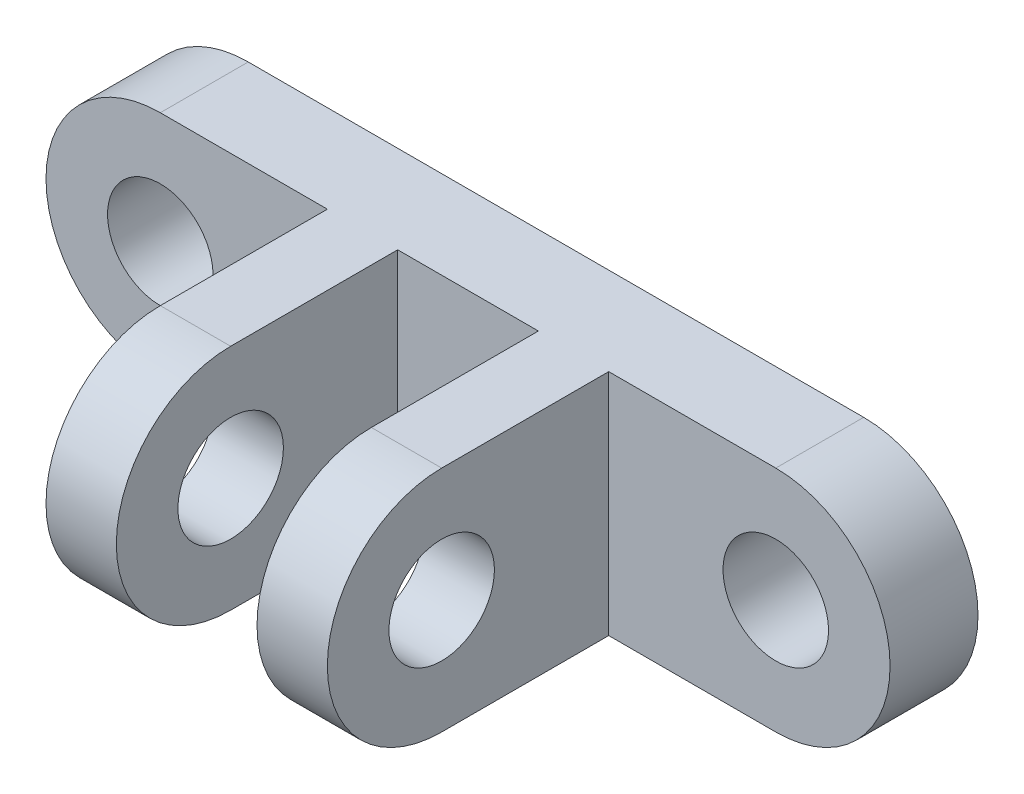
ISO-10303-21;
HEADER;
FILE_DESCRIPTION(('STEP AP214'),'2;1');
FILE_NAME('part.step','',(''),(''),'','','');
FILE_SCHEMA(('AUTOMOTIVE_DESIGN { 1 0 10303 214 1 1 1 1 }'));
ENDSEC;
DATA;
#1=APPLICATION_CONTEXT('core data for automotive mechanical design processes');
#2=APPLICATION_PROTOCOL_DEFINITION('international standard','automotive_design',2000,#1);
#3=PRODUCT_CONTEXT('',#1,'mechanical');
#4=PRODUCT('Part','Part','',(#3));
#5=PRODUCT_RELATED_PRODUCT_CATEGORY('part','',(#4));
#6=PRODUCT_DEFINITION_FORMATION('','',#4);
#7=PRODUCT_DEFINITION_CONTEXT('part definition',#1,'design');
#8=PRODUCT_DEFINITION('design','',#6,#7);
#9=PRODUCT_DEFINITION_SHAPE('','',#8);
#10=(LENGTH_UNIT() NAMED_UNIT(*) SI_UNIT(.MILLI.,.METRE.));
#11=(NAMED_UNIT(*) PLANE_ANGLE_UNIT() SI_UNIT($,.RADIAN.));
#12=(NAMED_UNIT(*) SI_UNIT($,.STERADIAN.) SOLID_ANGLE_UNIT());
#13=UNCERTAINTY_MEASURE_WITH_UNIT(LENGTH_MEASURE(1.E-05),#10,'distance_accuracy_value','');
#14=(GEOMETRIC_REPRESENTATION_CONTEXT(3) GLOBAL_UNCERTAINTY_ASSIGNED_CONTEXT((#13)) GLOBAL_UNIT_ASSIGNED_CONTEXT((#10,
#11,#12)) REPRESENTATION_CONTEXT('',''));
#15=CARTESIAN_POINT('',(0.,0.,0.));
#16=DIRECTION('',(0.,0.,1.));
#17=DIRECTION('',(1.,0.,0.));
#18=AXIS2_PLACEMENT_3D('',#15,#16,#17);
#19=CARTESIAN_POINT('',(-35.,0.,10.));
#20=DIRECTION('',(0.,0.,1.));
#21=DIRECTION('',(1.,0.,0.));
#22=AXIS2_PLACEMENT_3D('',#19,#20,#21);
#23=PLANE('',#22);
#24=DIRECTION('',(-1.,0.,0.));
#25=VECTOR('',#24,1.);
#26=CARTESIAN_POINT('',(-35.,13.,10.));
#27=LINE('',#26,#25);
#28=CARTESIAN_POINT('',(8.,13.,10.));
#29=VERTEX_POINT('',#28);
#30=CARTESIAN_POINT('',(-8.,13.,10.));
#31=VERTEX_POINT('',#30);
#32=EDGE_CURVE('E217',#29,#31,#27,.T.);
#33=ORIENTED_EDGE('',*,*,#32,.T.);
#34=DIRECTION('',(0.,1.,0.));
#35=VECTOR('',#34,1.);
#36=CARTESIAN_POINT('',(-8.,13.,10.));
#37=LINE('',#36,#35);
#38=CARTESIAN_POINT('',(-8.,-13.,10.));
#39=VERTEX_POINT('',#38);
#40=EDGE_CURVE('E51',#39,#31,#37,.T.);
#41=ORIENTED_EDGE('',*,*,#40,.F.);
#42=DIRECTION('',(1.,0.,0.));
#43=VECTOR('',#42,1.);
#44=CARTESIAN_POINT('',(-35.,-13.,10.));
#45=LINE('',#44,#43);
#46=CARTESIAN_POINT('',(8.,-13.,10.));
#47=VERTEX_POINT('',#46);
#48=EDGE_CURVE('E211',#39,#47,#45,.T.);
#49=ORIENTED_EDGE('',*,*,#48,.T.);
#50=DIRECTION('',(0.,1.,0.));
#51=VECTOR('',#50,1.);
#52=CARTESIAN_POINT('',(8.,13.,10.));
#53=LINE('',#52,#51);
#54=EDGE_CURVE('E165',#47,#29,#53,.T.);
#55=ORIENTED_EDGE('',*,*,#54,.T.);
#56=EDGE_LOOP('',(#33,#41,#49,#55));
#57=FACE_BOUND('',#56,.T.);
#58=ADVANCED_FACE('F36',(#57),#23,.T.);
#59=DIRECTION('',(0.,1.,0.));
#60=VECTOR('',#59,1.);
#61=CARTESIAN_POINT('',(-16.,13.,10.));
#62=LINE('',#61,#60);
#63=CARTESIAN_POINT('',(-16.,-13.,10.));
#64=VERTEX_POINT('',#63);
#65=CARTESIAN_POINT('',(-16.,13.,10.));
#66=VERTEX_POINT('',#65);
#67=EDGE_CURVE('E145',#64,#66,#62,.T.);
#68=ORIENTED_EDGE('',*,*,#67,.T.);
#69=CARTESIAN_POINT('',(-35.,13.,10.));
#70=VERTEX_POINT('',#69);
#71=EDGE_CURVE('E213',#66,#70,#27,.T.);
#72=ORIENTED_EDGE('',*,*,#71,.T.);
#73=CARTESIAN_POINT('',(-35.,0.,10.));
#74=DIRECTION('',(0.,0.,1.));
#75=DIRECTION('',(1.,0.,0.));
#76=AXIS2_PLACEMENT_3D('',#73,#74,#75);
#77=CIRCLE('',#76,13.);
#78=CARTESIAN_POINT('',(-35.,-13.,10.));
#79=VERTEX_POINT('',#78);
#80=EDGE_CURVE('E205',#70,#79,#77,.T.);
#81=ORIENTED_EDGE('',*,*,#80,.T.);
#82=EDGE_CURVE('E59',#79,#64,#45,.T.);
#83=ORIENTED_EDGE('',*,*,#82,.T.);
#84=EDGE_LOOP('',(#68,#72,#81,#83));
#85=FACE_BOUND('',#84,.T.);
#86=CARTESIAN_POINT('',(-35.,0.,10.));
#87=DIRECTION('',(0.,0.,1.));
#88=DIRECTION('',(1.,0.,0.));
#89=AXIS2_PLACEMENT_3D('',#86,#87,#88);
#90=CIRCLE('',#89,6.);
#91=CARTESIAN_POINT('',(-29.,0.,10.));
#92=VERTEX_POINT('',#91);
#93=EDGE_CURVE('E199',#92,#92,#90,.T.);
#94=ORIENTED_EDGE('',*,*,#93,.F.);
#95=EDGE_LOOP('',(#94));
#96=FACE_BOUND('',#95,.T.);
#97=ADVANCED_FACE('F249',(#85,#96),#23,.T.);
#98=DIRECTION('',(0.,1.,0.));
#99=VECTOR('',#98,1.);
#100=CARTESIAN_POINT('',(16.,13.,10.));
#101=LINE('',#100,#99);
#102=CARTESIAN_POINT('',(16.,-13.,10.));
#103=VERTEX_POINT('',#102);
#104=CARTESIAN_POINT('',(16.,13.,10.));
#105=VERTEX_POINT('',#104);
#106=EDGE_CURVE('E168',#103,#105,#101,.T.);
#107=ORIENTED_EDGE('',*,*,#106,.F.);
#108=CARTESIAN_POINT('',(35.,-13.,10.));
#109=VERTEX_POINT('',#108);
#110=EDGE_CURVE('E207',#103,#109,#45,.T.);
#111=ORIENTED_EDGE('',*,*,#110,.T.);
#112=CARTESIAN_POINT('',(35.,0.,10.));
#113=DIRECTION('',(0.,0.,1.));
#114=DIRECTION('',(1.,0.,0.));
#115=AXIS2_PLACEMENT_3D('',#112,#113,#114);
#116=CIRCLE('',#115,13.);
#117=CARTESIAN_POINT('',(35.,13.,10.));
#118=VERTEX_POINT('',#117);
#119=EDGE_CURVE('E210',#109,#118,#116,.T.);
#120=ORIENTED_EDGE('',*,*,#119,.T.);
#121=EDGE_CURVE('E214',#118,#105,#27,.T.);
#122=ORIENTED_EDGE('',*,*,#121,.T.);
#123=EDGE_LOOP('',(#107,#111,#120,#122));
#124=FACE_BOUND('',#123,.T.);
#125=CARTESIAN_POINT('',(35.,0.,10.));
#126=DIRECTION('',(0.,0.,1.));
#127=DIRECTION('',(1.,0.,0.));
#128=AXIS2_PLACEMENT_3D('',#125,#126,#127);
#129=CIRCLE('',#128,6.);
#130=CARTESIAN_POINT('',(41.,0.,10.));
#131=VERTEX_POINT('',#130);
#132=EDGE_CURVE('E193',#131,#131,#129,.T.);
#133=ORIENTED_EDGE('',*,*,#132,.F.);
#134=EDGE_LOOP('',(#133));
#135=FACE_BOUND('',#134,.T.);
#136=ADVANCED_FACE('F273',(#124,#135),#23,.T.);
#137=CARTESIAN_POINT('',(-35.,0.,0.));
#138=DIRECTION('',(0.,0.,1.));
#139=DIRECTION('',(1.,0.,0.));
#140=AXIS2_PLACEMENT_3D('',#137,#138,#139);
#141=PLANE('',#140);
#142=CARTESIAN_POINT('',(-35.,0.,0.));
#143=DIRECTION('',(0.,0.,1.));
#144=DIRECTION('',(1.,0.,0.));
#145=AXIS2_PLACEMENT_3D('',#142,#143,#144);
#146=CIRCLE('',#145,13.);
#147=CARTESIAN_POINT('',(-35.,13.,0.));
#148=VERTEX_POINT('',#147);
#149=CARTESIAN_POINT('',(-35.,-13.,0.));
#150=VERTEX_POINT('',#149);
#151=EDGE_CURVE('E202',#148,#150,#146,.T.);
#152=ORIENTED_EDGE('',*,*,#151,.F.);
#153=DIRECTION('',(-1.,0.,0.));
#154=VECTOR('',#153,1.);
#155=CARTESIAN_POINT('',(-35.,13.,0.));
#156=LINE('',#155,#154);
#157=CARTESIAN_POINT('',(35.,13.,0.));
#158=VERTEX_POINT('',#157);
#159=EDGE_CURVE('E208',#158,#148,#156,.T.);
#160=ORIENTED_EDGE('',*,*,#159,.F.);
#161=CARTESIAN_POINT('',(35.,0.,0.));
#162=DIRECTION('',(0.,0.,1.));
#163=DIRECTION('',(1.,0.,0.));
#164=AXIS2_PLACEMENT_3D('',#161,#162,#163);
#165=CIRCLE('',#164,13.);
#166=CARTESIAN_POINT('',(35.,-13.,0.));
#167=VERTEX_POINT('',#166);
#168=EDGE_CURVE('E222',#167,#158,#165,.T.);
#169=ORIENTED_EDGE('',*,*,#168,.F.);
#170=DIRECTION('',(1.,0.,0.));
#171=VECTOR('',#170,1.);
#172=CARTESIAN_POINT('',(-35.,-13.,0.));
#173=LINE('',#172,#171);
#174=EDGE_CURVE('E220',#150,#167,#173,.T.);
#175=ORIENTED_EDGE('',*,*,#174,.F.);
#176=EDGE_LOOP('',(#152,#160,#169,#175));
#177=FACE_BOUND('',#176,.T.);
#178=CARTESIAN_POINT('',(-35.,0.,0.));
#179=DIRECTION('',(0.,0.,1.));
#180=DIRECTION('',(1.,0.,0.));
#181=AXIS2_PLACEMENT_3D('',#178,#179,#180);
#182=CIRCLE('',#181,6.);
#183=CARTESIAN_POINT('',(-29.,0.,0.));
#184=VERTEX_POINT('',#183);
#185=EDGE_CURVE('E196',#184,#184,#182,.T.);
#186=ORIENTED_EDGE('',*,*,#185,.T.);
#187=EDGE_LOOP('',(#186));
#188=FACE_BOUND('',#187,.T.);
#189=CARTESIAN_POINT('',(35.,0.,0.));
#190=DIRECTION('',(0.,0.,1.));
#191=DIRECTION('',(1.,0.,0.));
#192=AXIS2_PLACEMENT_3D('',#189,#190,#191);
#193=CIRCLE('',#192,6.);
#194=CARTESIAN_POINT('',(41.,0.,0.));
#195=VERTEX_POINT('',#194);
#196=EDGE_CURVE('E192',#195,#195,#193,.T.);
#197=ORIENTED_EDGE('',*,*,#196,.T.);
#198=EDGE_LOOP('',(#197));
#199=FACE_BOUND('',#198,.T.);
#200=ADVANCED_FACE('F240',(#177,#188,#199),#141,.F.);
#201=CARTESIAN_POINT('',(-35.,0.,10.));
#202=DIRECTION('',(0.,0.,-1.));
#203=DIRECTION('',(-1.,0.,0.));
#204=AXIS2_PLACEMENT_3D('',#201,#202,#203);
#205=CYLINDRICAL_SURFACE('',#204,13.);
#206=ORIENTED_EDGE('',*,*,#151,.T.);
#207=DIRECTION('',(0.,0.,-1.));
#208=VECTOR('',#207,1.);
#209=CARTESIAN_POINT('',(-35.,-13.,10.));
#210=LINE('',#209,#208);
#211=EDGE_CURVE('E11',#79,#150,#210,.T.);
#212=ORIENTED_EDGE('',*,*,#211,.F.);
#213=ORIENTED_EDGE('',*,*,#80,.F.);
#214=DIRECTION('',(0.,0.,-1.));
#215=VECTOR('',#214,1.);
#216=CARTESIAN_POINT('',(-35.,13.,10.));
#217=LINE('',#216,#215);
#218=EDGE_CURVE('E216',#70,#148,#217,.T.);
#219=ORIENTED_EDGE('',*,*,#218,.T.);
#220=EDGE_LOOP('',(#206,#212,#213,#219));
#221=FACE_BOUND('',#220,.T.);
#222=ADVANCED_FACE('F38',(#221),#205,.T.);
#223=CARTESIAN_POINT('',(-35.,-13.,10.));
#224=DIRECTION('',(0.,1.,0.));
#225=DIRECTION('',(-1.,0.,0.));
#226=AXIS2_PLACEMENT_3D('',#223,#224,#225);
#227=PLANE('',#226);
#228=ORIENTED_EDGE('',*,*,#174,.T.);
#229=DIRECTION('',(0.,0.,-1.));
#230=VECTOR('',#229,1.);
#231=CARTESIAN_POINT('',(35.,-13.,10.));
#232=LINE('',#231,#230);
#233=EDGE_CURVE('E44',#109,#167,#232,.T.);
#234=ORIENTED_EDGE('',*,*,#233,.F.);
#235=ORIENTED_EDGE('',*,*,#110,.F.);
#236=DIRECTION('',(0.,0.,-1.));
#237=VECTOR('',#236,1.);
#238=CARTESIAN_POINT('',(16.,-13.,10.));
#239=LINE('',#238,#237);
#240=CARTESIAN_POINT('',(16.,-13.,29.));
#241=VERTEX_POINT('',#240);
#242=EDGE_CURVE('E176',#241,#103,#239,.T.);
#243=ORIENTED_EDGE('',*,*,#242,.F.);
#244=DIRECTION('',(-1.,0.,0.));
#245=VECTOR('',#244,1.);
#246=CARTESIAN_POINT('',(16.,-13.,29.));
#247=LINE('',#246,#245);
#248=CARTESIAN_POINT('',(8.,-13.,29.));
#249=VERTEX_POINT('',#248);
#250=EDGE_CURVE('E179',#241,#249,#247,.T.);
#251=ORIENTED_EDGE('',*,*,#250,.T.);
#252=DIRECTION('',(0.,0.,-1.));
#253=VECTOR('',#252,1.);
#254=CARTESIAN_POINT('',(8.,-13.,10.));
#255=LINE('',#254,#253);
#256=EDGE_CURVE('E172',#249,#47,#255,.T.);
#257=ORIENTED_EDGE('',*,*,#256,.T.);
#258=ORIENTED_EDGE('',*,*,#48,.F.);
#259=DIRECTION('',(0.,0.,-1.));
#260=VECTOR('',#259,1.);
#261=CARTESIAN_POINT('',(-8.,-13.,10.));
#262=LINE('',#261,#260);
#263=CARTESIAN_POINT('',(-8.,-13.,29.));
#264=VERTEX_POINT('',#263);
#265=EDGE_CURVE('E131',#264,#39,#262,.T.);
#266=ORIENTED_EDGE('',*,*,#265,.F.);
#267=DIRECTION('',(1.,0.,0.));
#268=VECTOR('',#267,1.);
#269=CARTESIAN_POINT('',(-16.,-13.,29.));
#270=LINE('',#269,#268);
#271=CARTESIAN_POINT('',(-16.,-13.,29.));
#272=VERTEX_POINT('',#271);
#273=EDGE_CURVE('E126',#272,#264,#270,.T.);
#274=ORIENTED_EDGE('',*,*,#273,.F.);
#275=DIRECTION('',(0.,0.,-1.));
#276=VECTOR('',#275,1.);
#277=CARTESIAN_POINT('',(-16.,-13.,10.));
#278=LINE('',#277,#276);
#279=EDGE_CURVE('E129',#272,#64,#278,.T.);
#280=ORIENTED_EDGE('',*,*,#279,.T.);
#281=ORIENTED_EDGE('',*,*,#82,.F.);
#282=ORIENTED_EDGE('',*,*,#211,.T.);
#283=EDGE_LOOP('',(#228,#234,#235,#243,#251,#257,#258,#266,#274,#280,#281,#282));
#284=FACE_BOUND('',#283,.T.);
#285=ADVANCED_FACE('F128',(#284),#227,.F.);
#286=CARTESIAN_POINT('',(35.,0.,10.));
#287=DIRECTION('',(0.,0.,-1.));
#288=DIRECTION('',(-1.,0.,0.));
#289=AXIS2_PLACEMENT_3D('',#286,#287,#288);
#290=CYLINDRICAL_SURFACE('',#289,13.);
#291=ORIENTED_EDGE('',*,*,#168,.T.);
#292=DIRECTION('',(0.,0.,-1.));
#293=VECTOR('',#292,1.);
#294=CARTESIAN_POINT('',(35.,13.,10.));
#295=LINE('',#294,#293);
#296=EDGE_CURVE('E227',#118,#158,#295,.T.);
#297=ORIENTED_EDGE('',*,*,#296,.F.);
#298=ORIENTED_EDGE('',*,*,#119,.F.);
#299=ORIENTED_EDGE('',*,*,#233,.T.);
#300=EDGE_LOOP('',(#291,#297,#298,#299));
#301=FACE_BOUND('',#300,.T.);
#302=ADVANCED_FACE('F234',(#301),#290,.T.);
#303=CARTESIAN_POINT('',(-35.,13.,10.));
#304=DIRECTION('',(0.,-1.,0.));
#305=DIRECTION('',(1.,0.,0.));
#306=AXIS2_PLACEMENT_3D('',#303,#304,#305);
#307=PLANE('',#306);
#308=ORIENTED_EDGE('',*,*,#159,.T.);
#309=ORIENTED_EDGE('',*,*,#218,.F.);
#310=ORIENTED_EDGE('',*,*,#71,.F.);
#311=DIRECTION('',(0.,0.,1.));
#312=VECTOR('',#311,1.);
#313=CARTESIAN_POINT('',(-16.,13.,10.));
#314=LINE('',#313,#312);
#315=CARTESIAN_POINT('',(-16.,13.,29.));
#316=VERTEX_POINT('',#315);
#317=EDGE_CURVE('E148',#66,#316,#314,.T.);
#318=ORIENTED_EDGE('',*,*,#317,.T.);
#319=DIRECTION('',(1.,0.,0.));
#320=VECTOR('',#319,1.);
#321=CARTESIAN_POINT('',(-16.,13.,29.));
#322=LINE('',#321,#320);
#323=CARTESIAN_POINT('',(-8.,13.,29.));
#324=VERTEX_POINT('',#323);
#325=EDGE_CURVE('E137',#316,#324,#322,.T.);
#326=ORIENTED_EDGE('',*,*,#325,.T.);
#327=DIRECTION('',(0.,0.,1.));
#328=VECTOR('',#327,1.);
#329=CARTESIAN_POINT('',(-8.,13.,10.));
#330=LINE('',#329,#328);
#331=EDGE_CURVE('E158',#31,#324,#330,.T.);
#332=ORIENTED_EDGE('',*,*,#331,.F.);
#333=ORIENTED_EDGE('',*,*,#32,.F.);
#334=DIRECTION('',(0.,0.,1.));
#335=VECTOR('',#334,1.);
#336=CARTESIAN_POINT('',(8.,13.,10.));
#337=LINE('',#336,#335);
#338=CARTESIAN_POINT('',(8.,13.,29.));
#339=VERTEX_POINT('',#338);
#340=EDGE_CURVE('E181',#29,#339,#337,.T.);
#341=ORIENTED_EDGE('',*,*,#340,.T.);
#342=DIRECTION('',(-1.,0.,0.));
#343=VECTOR('',#342,1.);
#344=CARTESIAN_POINT('',(16.,13.,29.));
#345=LINE('',#344,#343);
#346=CARTESIAN_POINT('',(16.,13.,29.));
#347=VERTEX_POINT('',#346);
#348=EDGE_CURVE('E189',#347,#339,#345,.T.);
#349=ORIENTED_EDGE('',*,*,#348,.F.);
#350=DIRECTION('',(0.,0.,1.));
#351=VECTOR('',#350,1.);
#352=CARTESIAN_POINT('',(16.,13.,10.));
#353=LINE('',#352,#351);
#354=EDGE_CURVE('E171',#105,#347,#353,.T.);
#355=ORIENTED_EDGE('',*,*,#354,.F.);
#356=ORIENTED_EDGE('',*,*,#121,.F.);
#357=ORIENTED_EDGE('',*,*,#296,.T.);
#358=EDGE_LOOP('',(#308,#309,#310,#318,#326,#332,#333,#341,#349,#355,#356,#357));
#359=FACE_BOUND('',#358,.T.);
#360=ADVANCED_FACE('F244',(#359),#307,.F.);
#361=CARTESIAN_POINT('',(-35.,0.,10.));
#362=DIRECTION('',(0.,0.,-1.));
#363=DIRECTION('',(-1.,0.,0.));
#364=AXIS2_PLACEMENT_3D('',#361,#362,#363);
#365=CYLINDRICAL_SURFACE('',#364,6.);
#366=ORIENTED_EDGE('',*,*,#93,.T.);
#367=EDGE_LOOP('',(#366));
#368=FACE_BOUND('',#367,.T.);
#369=ORIENTED_EDGE('',*,*,#185,.F.);
#370=EDGE_LOOP('',(#369));
#371=FACE_BOUND('',#370,.T.);
#372=ADVANCED_FACE('F291',(#368,#371),#365,.F.);
#373=CARTESIAN_POINT('',(35.,0.,10.));
#374=DIRECTION('',(0.,0.,-1.));
#375=DIRECTION('',(-1.,0.,0.));
#376=AXIS2_PLACEMENT_3D('',#373,#374,#375);
#377=CYLINDRICAL_SURFACE('',#376,6.);
#378=ORIENTED_EDGE('',*,*,#132,.T.);
#379=EDGE_LOOP('',(#378));
#380=FACE_BOUND('',#379,.T.);
#381=ORIENTED_EDGE('',*,*,#196,.F.);
#382=EDGE_LOOP('',(#381));
#383=FACE_BOUND('',#382,.T.);
#384=ADVANCED_FACE('F287',(#380,#383),#377,.F.);
#385=CARTESIAN_POINT('',(16.,0.,29.));
#386=DIRECTION('',(1.,0.,0.));
#387=DIRECTION('',(0.,0.,-1.));
#388=AXIS2_PLACEMENT_3D('',#385,#386,#387);
#389=PLANE('',#388);
#390=ORIENTED_EDGE('',*,*,#106,.T.);
#391=ORIENTED_EDGE('',*,*,#354,.T.);
#392=CARTESIAN_POINT('',(16.,0.,29.));
#393=DIRECTION('',(1.,0.,0.));
#394=DIRECTION('',(0.,0.,-1.));
#395=AXIS2_PLACEMENT_3D('',#392,#393,#394);
#396=CIRCLE('',#395,13.);
#397=EDGE_CURVE('E174',#347,#241,#396,.T.);
#398=ORIENTED_EDGE('',*,*,#397,.T.);
#399=ORIENTED_EDGE('',*,*,#242,.T.);
#400=EDGE_LOOP('',(#390,#391,#398,#399));
#401=FACE_BOUND('',#400,.T.);
#402=CARTESIAN_POINT('',(16.,0.,29.));
#403=DIRECTION('',(1.,0.,0.));
#404=DIRECTION('',(0.,0.,-1.));
#405=AXIS2_PLACEMENT_3D('',#402,#403,#404);
#406=CIRCLE('',#405,6.);
#407=CARTESIAN_POINT('',(16.,0.,23.));
#408=VERTEX_POINT('',#407);
#409=EDGE_CURVE('E162',#408,#408,#406,.T.);
#410=ORIENTED_EDGE('',*,*,#409,.F.);
#411=EDGE_LOOP('',(#410));
#412=FACE_BOUND('',#411,.T.);
#413=ADVANCED_FACE('F290',(#401,#412),#389,.T.);
#414=CARTESIAN_POINT('',(8.,0.,29.));
#415=DIRECTION('',(1.,0.,0.));
#416=DIRECTION('',(0.,0.,-1.));
#417=AXIS2_PLACEMENT_3D('',#414,#415,#416);
#418=PLANE('',#417);
#419=ORIENTED_EDGE('',*,*,#54,.F.);
#420=ORIENTED_EDGE('',*,*,#256,.F.);
#421=CARTESIAN_POINT('',(8.,0.,29.));
#422=DIRECTION('',(1.,0.,0.));
#423=DIRECTION('',(0.,0.,-1.));
#424=AXIS2_PLACEMENT_3D('',#421,#422,#423);
#425=CIRCLE('',#424,13.);
#426=EDGE_CURVE('E183',#339,#249,#425,.T.);
#427=ORIENTED_EDGE('',*,*,#426,.F.);
#428=ORIENTED_EDGE('',*,*,#340,.F.);
#429=EDGE_LOOP('',(#419,#420,#427,#428));
#430=FACE_BOUND('',#429,.T.);
#431=CARTESIAN_POINT('',(8.,0.,29.));
#432=DIRECTION('',(1.,0.,0.));
#433=DIRECTION('',(0.,0.,-1.));
#434=AXIS2_PLACEMENT_3D('',#431,#432,#433);
#435=CIRCLE('',#434,6.);
#436=CARTESIAN_POINT('',(8.,0.,23.));
#437=VERTEX_POINT('',#436);
#438=EDGE_CURVE('E136',#437,#437,#435,.T.);
#439=ORIENTED_EDGE('',*,*,#438,.T.);
#440=EDGE_LOOP('',(#439));
#441=FACE_BOUND('',#440,.T.);
#442=ADVANCED_FACE('F299',(#430,#441),#418,.F.);
#443=CARTESIAN_POINT('',(16.,0.,29.));
#444=DIRECTION('',(-1.,0.,0.));
#445=DIRECTION('',(0.,0.,1.));
#446=AXIS2_PLACEMENT_3D('',#443,#444,#445);
#447=CYLINDRICAL_SURFACE('',#446,13.);
#448=ORIENTED_EDGE('',*,*,#426,.T.);
#449=ORIENTED_EDGE('',*,*,#250,.F.);
#450=ORIENTED_EDGE('',*,*,#397,.F.);
#451=ORIENTED_EDGE('',*,*,#348,.T.);
#452=EDGE_LOOP('',(#448,#449,#450,#451));
#453=FACE_BOUND('',#452,.T.);
#454=ADVANCED_FACE('F304',(#453),#447,.T.);
#455=CARTESIAN_POINT('',(16.,0.,29.));
#456=DIRECTION('',(-1.,0.,0.));
#457=DIRECTION('',(0.,0.,1.));
#458=AXIS2_PLACEMENT_3D('',#455,#456,#457);
#459=CYLINDRICAL_SURFACE('',#458,6.);
#460=ORIENTED_EDGE('',*,*,#409,.T.);
#461=EDGE_LOOP('',(#460));
#462=FACE_BOUND('',#461,.T.);
#463=ORIENTED_EDGE('',*,*,#438,.F.);
#464=EDGE_LOOP('',(#463));
#465=FACE_BOUND('',#464,.T.);
#466=ADVANCED_FACE('F307',(#462,#465),#459,.F.);
#467=CARTESIAN_POINT('',(-16.,0.,29.));
#468=DIRECTION('',(1.,0.,0.));
#469=DIRECTION('',(0.,0.,-1.));
#470=AXIS2_PLACEMENT_3D('',#467,#468,#469);
#471=CYLINDRICAL_SURFACE('',#470,13.);
#472=CARTESIAN_POINT('',(-8.,0.,29.));
#473=DIRECTION('',(1.,0.,0.));
#474=DIRECTION('',(0.,0.,-1.));
#475=AXIS2_PLACEMENT_3D('',#472,#473,#474);
#476=CIRCLE('',#475,13.);
#477=EDGE_CURVE('E156',#324,#264,#476,.T.);
#478=ORIENTED_EDGE('',*,*,#477,.F.);
#479=ORIENTED_EDGE('',*,*,#325,.F.);
#480=CARTESIAN_POINT('',(-16.,0.,29.));
#481=DIRECTION('',(1.,0.,0.));
#482=DIRECTION('',(0.,0.,-1.));
#483=AXIS2_PLACEMENT_3D('',#480,#481,#482);
#484=CIRCLE('',#483,13.);
#485=EDGE_CURVE('E143',#316,#272,#484,.T.);
#486=ORIENTED_EDGE('',*,*,#485,.T.);
#487=ORIENTED_EDGE('',*,*,#273,.T.);
#488=EDGE_LOOP('',(#478,#479,#486,#487));
#489=FACE_BOUND('',#488,.T.);
#490=ADVANCED_FACE('F147',(#489),#471,.T.);
#491=CARTESIAN_POINT('',(-16.,0.,29.));
#492=DIRECTION('',(-1.,0.,0.));
#493=DIRECTION('',(0.,0.,-1.));
#494=AXIS2_PLACEMENT_3D('',#491,#492,#493);
#495=PLANE('',#494);
#496=CARTESIAN_POINT('',(-16.,0.,29.));
#497=DIRECTION('',(1.,0.,0.));
#498=DIRECTION('',(0.,0.,-1.));
#499=AXIS2_PLACEMENT_3D('',#496,#497,#498);
#500=CIRCLE('',#499,6.);
#501=CARTESIAN_POINT('',(-16.,0.,23.));
#502=VERTEX_POINT('',#501);
#503=EDGE_CURVE('E154',#502,#502,#500,.T.);
#504=ORIENTED_EDGE('',*,*,#503,.T.);
#505=EDGE_LOOP('',(#504));
#506=FACE_BOUND('',#505,.T.);
#507=ORIENTED_EDGE('',*,*,#67,.F.);
#508=ORIENTED_EDGE('',*,*,#279,.F.);
#509=ORIENTED_EDGE('',*,*,#485,.F.);
#510=ORIENTED_EDGE('',*,*,#317,.F.);
#511=EDGE_LOOP('',(#507,#508,#509,#510));
#512=FACE_BOUND('',#511,.T.);
#513=ADVANCED_FACE('F141',(#506,#512),#495,.T.);
#514=CARTESIAN_POINT('',(-8.,0.,29.));
#515=DIRECTION('',(-1.,0.,0.));
#516=DIRECTION('',(0.,0.,-1.));
#517=AXIS2_PLACEMENT_3D('',#514,#515,#516);
#518=PLANE('',#517);
#519=CARTESIAN_POINT('',(-8.,0.,29.));
#520=DIRECTION('',(1.,0.,0.));
#521=DIRECTION('',(0.,0.,-1.));
#522=AXIS2_PLACEMENT_3D('',#519,#520,#521);
#523=CIRCLE('',#522,6.);
#524=CARTESIAN_POINT('',(-8.,0.,23.));
#525=VERTEX_POINT('',#524);
#526=EDGE_CURVE('E449',#525,#525,#523,.T.);
#527=ORIENTED_EDGE('',*,*,#526,.F.);
#528=EDGE_LOOP('',(#527));
#529=FACE_BOUND('',#528,.T.);
#530=ORIENTED_EDGE('',*,*,#40,.T.);
#531=ORIENTED_EDGE('',*,*,#331,.T.);
#532=ORIENTED_EDGE('',*,*,#477,.T.);
#533=ORIENTED_EDGE('',*,*,#265,.T.);
#534=EDGE_LOOP('',(#530,#531,#532,#533));
#535=FACE_BOUND('',#534,.T.);
#536=ADVANCED_FACE('F256',(#529,#535),#518,.F.);
#537=CARTESIAN_POINT('',(-16.,0.,29.));
#538=DIRECTION('',(1.,0.,0.));
#539=DIRECTION('',(0.,0.,-1.));
#540=AXIS2_PLACEMENT_3D('',#537,#538,#539);
#541=CYLINDRICAL_SURFACE('',#540,6.);
#542=ORIENTED_EDGE('',*,*,#503,.F.);
#543=EDGE_LOOP('',(#542));
#544=FACE_BOUND('',#543,.T.);
#545=ORIENTED_EDGE('',*,*,#526,.T.);
#546=EDGE_LOOP('',(#545));
#547=FACE_BOUND('',#546,.T.);
#548=ADVANCED_FACE('F258',(#544,#547),#541,.F.);
#549=CLOSED_SHELL('',(#58,#97,#136,#200,#222,#285,#302,#360,#372,#384,#413,#442,#454,#466,#490,
#513,#536,#548));
#550=MANIFOLD_SOLID_BREP('B2',#549);
#551=ADVANCED_BREP_SHAPE_REPRESENTATION('',(#18,#550),#14);
#552=SHAPE_DEFINITION_REPRESENTATION(#9,#551);
ENDSEC;
END-ISO-10303-21;
